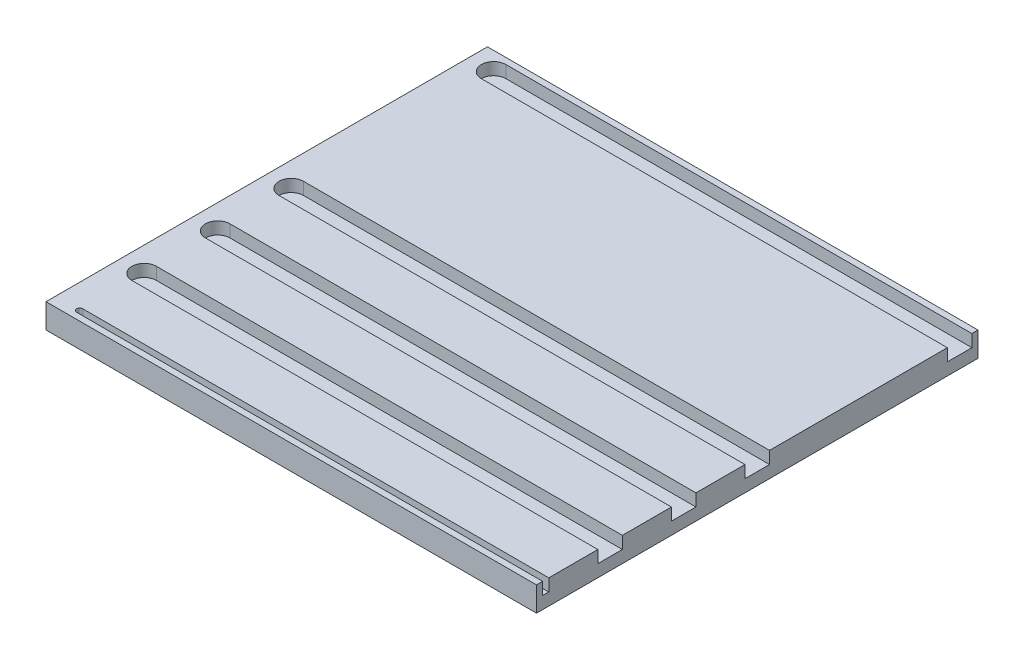
ISO-10303-21;
HEADER;
FILE_DESCRIPTION(('STEP AP214'),'2;1');
FILE_NAME('part.step','',(''),(''),'','','');
FILE_SCHEMA(('AUTOMOTIVE_DESIGN { 1 0 10303 214 1 1 1 1 }'));
ENDSEC;
DATA;
#1=APPLICATION_CONTEXT('core data for automotive mechanical design processes');
#2=APPLICATION_PROTOCOL_DEFINITION('international standard','automotive_design',2000,#1);
#3=PRODUCT_CONTEXT('',#1,'mechanical');
#4=PRODUCT('Part','Part','',(#3));
#5=PRODUCT_RELATED_PRODUCT_CATEGORY('part','',(#4));
#6=PRODUCT_DEFINITION_FORMATION('','',#4);
#7=PRODUCT_DEFINITION_CONTEXT('part definition',#1,'design');
#8=PRODUCT_DEFINITION('design','',#6,#7);
#9=PRODUCT_DEFINITION_SHAPE('','',#8);
#10=(LENGTH_UNIT() NAMED_UNIT(*) SI_UNIT(.MILLI.,.METRE.));
#11=(NAMED_UNIT(*) PLANE_ANGLE_UNIT() SI_UNIT($,.RADIAN.));
#12=(NAMED_UNIT(*) SI_UNIT($,.STERADIAN.) SOLID_ANGLE_UNIT());
#13=UNCERTAINTY_MEASURE_WITH_UNIT(LENGTH_MEASURE(1.E-05),#10,'distance_accuracy_value','');
#14=(GEOMETRIC_REPRESENTATION_CONTEXT(3) GLOBAL_UNCERTAINTY_ASSIGNED_CONTEXT((#13)) GLOBAL_UNIT_ASSIGNED_CONTEXT((#10,
#11,#12)) REPRESENTATION_CONTEXT('',''));
#15=CARTESIAN_POINT('',(0.,0.,0.));
#16=DIRECTION('',(0.,0.,1.));
#17=DIRECTION('',(1.,0.,0.));
#18=AXIS2_PLACEMENT_3D('',#15,#16,#17);
#19=CARTESIAN_POINT('',(6.35,6.35,-2.38125));
#20=DIRECTION('',(0.,-1.,0.));
#21=DIRECTION('',(0.,0.,-1.));
#22=AXIS2_PLACEMENT_3D('',#19,#20,#21);
#23=CYLINDRICAL_SURFACE('',#22,0.79375);
#24=CARTESIAN_POINT('',(6.35,3.175,-2.38125));
#25=DIRECTION('',(0.,1.,0.));
#26=DIRECTION('',(0.,0.,1.));
#27=AXIS2_PLACEMENT_3D('',#24,#25,#26);
#28=CIRCLE('',#27,0.79375);
#29=CARTESIAN_POINT('',(6.34999999999999,3.175,-3.17500000000001));
#30=VERTEX_POINT('',#29);
#31=CARTESIAN_POINT('',(6.34999999999999,3.175,-1.5875));
#32=VERTEX_POINT('',#31);
#33=EDGE_CURVE('E197',#30,#32,#28,.T.);
#34=ORIENTED_EDGE('',*,*,#33,.F.);
#35=DIRECTION('',(0.,-1.,0.));
#36=VECTOR('',#35,1.);
#37=CARTESIAN_POINT('',(6.34999999999999,6.35,-3.17500000000001));
#38=LINE('',#37,#36);
#39=CARTESIAN_POINT('',(6.34999999999999,6.35,-3.17500000000001));
#40=VERTEX_POINT('',#39);
#41=EDGE_CURVE('E11',#40,#30,#38,.T.);
#42=ORIENTED_EDGE('',*,*,#41,.F.);
#43=CARTESIAN_POINT('',(6.35,6.35,-2.38125));
#44=DIRECTION('',(0.,1.,0.));
#45=DIRECTION('',(0.,0.,1.));
#46=AXIS2_PLACEMENT_3D('',#43,#44,#45);
#47=CIRCLE('',#46,0.79375);
#48=CARTESIAN_POINT('',(6.34999999999999,6.35,-1.5875));
#49=VERTEX_POINT('',#48);
#50=EDGE_CURVE('E195',#40,#49,#47,.T.);
#51=ORIENTED_EDGE('',*,*,#50,.T.);
#52=DIRECTION('',(0.,-1.,0.));
#53=VECTOR('',#52,1.);
#54=CARTESIAN_POINT('',(6.34999999999999,6.35,-1.5875));
#55=LINE('',#54,#53);
#56=EDGE_CURVE('E264',#49,#32,#55,.T.);
#57=ORIENTED_EDGE('',*,*,#56,.T.);
#58=EDGE_LOOP('',(#34,#42,#51,#57));
#59=FACE_BOUND('',#58,.T.);
#60=ADVANCED_FACE('F33',(#59),#23,.F.);
#61=CARTESIAN_POINT('',(-69.5401100254638,6.35,-3.175));
#62=DIRECTION('',(0.,0.,1.));
#63=DIRECTION('',(1.,0.,0.));
#64=AXIS2_PLACEMENT_3D('',#61,#62,#63);
#65=PLANE('',#64);
#66=DIRECTION('',(-1.,0.,0.));
#67=VECTOR('',#66,1.);
#68=CARTESIAN_POINT('',(-69.5401100254638,3.175,-3.175));
#69=LINE('',#68,#67);
#70=CARTESIAN_POINT('',(127.,3.175,-3.17500000000001));
#71=VERTEX_POINT('',#70);
#72=EDGE_CURVE('E338',#71,#30,#69,.T.);
#73=ORIENTED_EDGE('',*,*,#72,.F.);
#74=DIRECTION('',(0.,-1.,0.));
#75=VECTOR('',#74,1.);
#76=CARTESIAN_POINT('',(127.,6.35,-3.17500000000001));
#77=LINE('',#76,#75);
#78=CARTESIAN_POINT('',(127.,6.35,-3.17500000000001));
#79=VERTEX_POINT('',#78);
#80=EDGE_CURVE('E40',#79,#71,#77,.T.);
#81=ORIENTED_EDGE('',*,*,#80,.F.);
#82=DIRECTION('',(-1.,0.,0.));
#83=VECTOR('',#82,1.);
#84=CARTESIAN_POINT('',(-69.5401100254638,6.35,-3.175));
#85=LINE('',#84,#83);
#86=EDGE_CURVE('E204',#79,#40,#85,.T.);
#87=ORIENTED_EDGE('',*,*,#86,.T.);
#88=ORIENTED_EDGE('',*,*,#41,.T.);
#89=EDGE_LOOP('',(#73,#81,#87,#88));
#90=FACE_BOUND('',#89,.T.);
#91=ADVANCED_FACE('F210',(#90),#65,.T.);
#92=CARTESIAN_POINT('',(-69.5401100254638,6.35,-15.875));
#93=DIRECTION('',(0.,0.,1.));
#94=DIRECTION('',(1.,0.,0.));
#95=AXIS2_PLACEMENT_3D('',#92,#93,#94);
#96=PLANE('',#95);
#97=DIRECTION('',(0.,-1.,0.));
#98=VECTOR('',#97,1.);
#99=CARTESIAN_POINT('',(127.,6.35,-15.875));
#100=LINE('',#99,#98);
#101=CARTESIAN_POINT('',(127.,6.35,-15.875));
#102=VERTEX_POINT('',#101);
#103=CARTESIAN_POINT('',(127.,3.175,-15.875));
#104=VERTEX_POINT('',#103);
#105=EDGE_CURVE('E328',#102,#104,#100,.T.);
#106=ORIENTED_EDGE('',*,*,#105,.T.);
#107=DIRECTION('',(-1.,0.,0.));
#108=VECTOR('',#107,1.);
#109=CARTESIAN_POINT('',(-69.5401100254638,3.175,-15.875));
#110=LINE('',#109,#108);
#111=CARTESIAN_POINT('',(6.34999999999999,3.175,-15.875));
#112=VERTEX_POINT('',#111);
#113=EDGE_CURVE('E347',#104,#112,#110,.T.);
#114=ORIENTED_EDGE('',*,*,#113,.T.);
#115=DIRECTION('',(0.,-1.,0.));
#116=VECTOR('',#115,1.);
#117=CARTESIAN_POINT('',(6.34999999999999,6.35,-15.875));
#118=LINE('',#117,#116);
#119=CARTESIAN_POINT('',(6.34999999999999,6.35,-15.875));
#120=VERTEX_POINT('',#119);
#121=EDGE_CURVE('E325',#120,#112,#118,.T.);
#122=ORIENTED_EDGE('',*,*,#121,.F.);
#123=DIRECTION('',(-1.,0.,0.));
#124=VECTOR('',#123,1.);
#125=CARTESIAN_POINT('',(-69.5401100254638,6.35,-15.875));
#126=LINE('',#125,#124);
#127=EDGE_CURVE('E215',#102,#120,#126,.T.);
#128=ORIENTED_EDGE('',*,*,#127,.F.);
#129=EDGE_LOOP('',(#106,#114,#122,#128));
#130=FACE_BOUND('',#129,.T.);
#131=ADVANCED_FACE('F445',(#130),#96,.F.);
#132=CARTESIAN_POINT('',(6.35,6.35,-19.05));
#133=DIRECTION('',(0.,-1.,0.));
#134=DIRECTION('',(0.,0.,-1.));
#135=AXIS2_PLACEMENT_3D('',#132,#133,#134);
#136=CYLINDRICAL_SURFACE('',#135,3.175);
#137=CARTESIAN_POINT('',(6.35,3.175,-19.05));
#138=DIRECTION('',(0.,1.,0.));
#139=DIRECTION('',(0.,0.,1.));
#140=AXIS2_PLACEMENT_3D('',#137,#138,#139);
#141=CIRCLE('',#140,3.175);
#142=CARTESIAN_POINT('',(6.34999999999999,3.175,-22.225));
#143=VERTEX_POINT('',#142);
#144=EDGE_CURVE('E349',#143,#112,#141,.T.);
#145=ORIENTED_EDGE('',*,*,#144,.F.);
#146=DIRECTION('',(0.,-1.,0.));
#147=VECTOR('',#146,1.);
#148=CARTESIAN_POINT('',(6.34999999999999,6.35,-22.225));
#149=LINE('',#148,#147);
#150=CARTESIAN_POINT('',(6.34999999999999,6.35,-22.225));
#151=VERTEX_POINT('',#150);
#152=EDGE_CURVE('E322',#151,#143,#149,.T.);
#153=ORIENTED_EDGE('',*,*,#152,.F.);
#154=CARTESIAN_POINT('',(6.35,6.35,-19.05));
#155=DIRECTION('',(0.,1.,0.));
#156=DIRECTION('',(0.,0.,1.));
#157=AXIS2_PLACEMENT_3D('',#154,#155,#156);
#158=CIRCLE('',#157,3.175);
#159=EDGE_CURVE('E222',#151,#120,#158,.T.);
#160=ORIENTED_EDGE('',*,*,#159,.T.);
#161=ORIENTED_EDGE('',*,*,#121,.T.);
#162=EDGE_LOOP('',(#145,#153,#160,#161));
#163=FACE_BOUND('',#162,.T.);
#164=ADVANCED_FACE('F449',(#163),#136,.F.);
#165=CARTESIAN_POINT('',(-69.5401100254638,6.35,-22.225));
#166=DIRECTION('',(0.,0.,1.));
#167=DIRECTION('',(1.,0.,0.));
#168=AXIS2_PLACEMENT_3D('',#165,#166,#167);
#169=PLANE('',#168);
#170=DIRECTION('',(-1.,0.,0.));
#171=VECTOR('',#170,1.);
#172=CARTESIAN_POINT('',(-69.5401100254638,3.175,-22.225));
#173=LINE('',#172,#171);
#174=CARTESIAN_POINT('',(127.,3.175,-22.225));
#175=VERTEX_POINT('',#174);
#176=EDGE_CURVE('E352',#175,#143,#173,.T.);
#177=ORIENTED_EDGE('',*,*,#176,.F.);
#178=DIRECTION('',(0.,-1.,0.));
#179=VECTOR('',#178,1.);
#180=CARTESIAN_POINT('',(127.,6.35,-22.225));
#181=LINE('',#180,#179);
#182=CARTESIAN_POINT('',(127.,6.35,-22.225));
#183=VERTEX_POINT('',#182);
#184=EDGE_CURVE('E319',#183,#175,#181,.T.);
#185=ORIENTED_EDGE('',*,*,#184,.F.);
#186=DIRECTION('',(-1.,0.,0.));
#187=VECTOR('',#186,1.);
#188=CARTESIAN_POINT('',(-69.5401100254638,6.35,-22.225));
#189=LINE('',#188,#187);
#190=EDGE_CURVE('E225',#183,#151,#189,.T.);
#191=ORIENTED_EDGE('',*,*,#190,.T.);
#192=ORIENTED_EDGE('',*,*,#152,.T.);
#193=EDGE_LOOP('',(#177,#185,#191,#192));
#194=FACE_BOUND('',#193,.T.);
#195=ADVANCED_FACE('F455',(#194),#169,.T.);
#196=CARTESIAN_POINT('',(-69.5401100254638,6.35,-34.925));
#197=DIRECTION('',(0.,0.,1.));
#198=DIRECTION('',(1.,0.,0.));
#199=AXIS2_PLACEMENT_3D('',#196,#197,#198);
#200=PLANE('',#199);
#201=DIRECTION('',(0.,-1.,0.));
#202=VECTOR('',#201,1.);
#203=CARTESIAN_POINT('',(127.,6.35,-34.925));
#204=LINE('',#203,#202);
#205=CARTESIAN_POINT('',(127.,6.35,-34.925));
#206=VERTEX_POINT('',#205);
#207=CARTESIAN_POINT('',(127.,3.175,-34.925));
#208=VERTEX_POINT('',#207);
#209=EDGE_CURVE('E317',#206,#208,#204,.T.);
#210=ORIENTED_EDGE('',*,*,#209,.T.);
#211=DIRECTION('',(-1.,0.,0.));
#212=VECTOR('',#211,1.);
#213=CARTESIAN_POINT('',(-69.5401100254638,3.175,-34.925));
#214=LINE('',#213,#212);
#215=CARTESIAN_POINT('',(6.34999999999999,3.175,-34.925));
#216=VERTEX_POINT('',#215);
#217=EDGE_CURVE('E358',#208,#216,#214,.T.);
#218=ORIENTED_EDGE('',*,*,#217,.T.);
#219=DIRECTION('',(0.,-1.,0.));
#220=VECTOR('',#219,1.);
#221=CARTESIAN_POINT('',(6.34999999999999,6.35,-34.925));
#222=LINE('',#221,#220);
#223=CARTESIAN_POINT('',(6.34999999999999,6.35,-34.925));
#224=VERTEX_POINT('',#223);
#225=EDGE_CURVE('E314',#224,#216,#222,.T.);
#226=ORIENTED_EDGE('',*,*,#225,.F.);
#227=DIRECTION('',(-1.,0.,0.));
#228=VECTOR('',#227,1.);
#229=CARTESIAN_POINT('',(-69.5401100254638,6.35,-34.925));
#230=LINE('',#229,#228);
#231=EDGE_CURVE('E228',#206,#224,#230,.T.);
#232=ORIENTED_EDGE('',*,*,#231,.F.);
#233=EDGE_LOOP('',(#210,#218,#226,#232));
#234=FACE_BOUND('',#233,.T.);
#235=ADVANCED_FACE('F424',(#234),#200,.F.);
#236=CARTESIAN_POINT('',(6.35,6.35,-38.1));
#237=DIRECTION('',(0.,-1.,0.));
#238=DIRECTION('',(0.,0.,-1.));
#239=AXIS2_PLACEMENT_3D('',#236,#237,#238);
#240=CYLINDRICAL_SURFACE('',#239,3.175);
#241=CARTESIAN_POINT('',(6.35,3.175,-38.1));
#242=DIRECTION('',(0.,1.,0.));
#243=DIRECTION('',(0.,0.,1.));
#244=AXIS2_PLACEMENT_3D('',#241,#242,#243);
#245=CIRCLE('',#244,3.175);
#246=CARTESIAN_POINT('',(6.34999999999999,3.175,-41.275));
#247=VERTEX_POINT('',#246);
#248=EDGE_CURVE('E360',#247,#216,#245,.T.);
#249=ORIENTED_EDGE('',*,*,#248,.F.);
#250=DIRECTION('',(0.,-1.,0.));
#251=VECTOR('',#250,1.);
#252=CARTESIAN_POINT('',(6.34999999999999,6.35,-41.275));
#253=LINE('',#252,#251);
#254=CARTESIAN_POINT('',(6.34999999999999,6.35,-41.275));
#255=VERTEX_POINT('',#254);
#256=EDGE_CURVE('E311',#255,#247,#253,.T.);
#257=ORIENTED_EDGE('',*,*,#256,.F.);
#258=CARTESIAN_POINT('',(6.35,6.35,-38.1));
#259=DIRECTION('',(0.,1.,0.));
#260=DIRECTION('',(0.,0.,1.));
#261=AXIS2_PLACEMENT_3D('',#258,#259,#260);
#262=CIRCLE('',#261,3.175);
#263=EDGE_CURVE('E230',#255,#224,#262,.T.);
#264=ORIENTED_EDGE('',*,*,#263,.T.);
#265=ORIENTED_EDGE('',*,*,#225,.T.);
#266=EDGE_LOOP('',(#249,#257,#264,#265));
#267=FACE_BOUND('',#266,.T.);
#268=ADVANCED_FACE('F426',(#267),#240,.F.);
#269=CARTESIAN_POINT('',(-69.5401100254638,6.35,-41.275));
#270=DIRECTION('',(0.,0.,1.));
#271=DIRECTION('',(1.,0.,0.));
#272=AXIS2_PLACEMENT_3D('',#269,#270,#271);
#273=PLANE('',#272);
#274=DIRECTION('',(-1.,0.,0.));
#275=VECTOR('',#274,1.);
#276=CARTESIAN_POINT('',(-69.5401100254638,3.175,-41.275));
#277=LINE('',#276,#275);
#278=CARTESIAN_POINT('',(127.,3.175,-41.275));
#279=VERTEX_POINT('',#278);
#280=EDGE_CURVE('E363',#279,#247,#277,.T.);
#281=ORIENTED_EDGE('',*,*,#280,.F.);
#282=DIRECTION('',(0.,-1.,0.));
#283=VECTOR('',#282,1.);
#284=CARTESIAN_POINT('',(127.,6.35,-41.275));
#285=LINE('',#284,#283);
#286=CARTESIAN_POINT('',(127.,6.35,-41.275));
#287=VERTEX_POINT('',#286);
#288=EDGE_CURVE('E308',#287,#279,#285,.T.);
#289=ORIENTED_EDGE('',*,*,#288,.F.);
#290=DIRECTION('',(-1.,0.,0.));
#291=VECTOR('',#290,1.);
#292=CARTESIAN_POINT('',(-69.5401100254638,6.35,-41.275));
#293=LINE('',#292,#291);
#294=EDGE_CURVE('E233',#287,#255,#293,.T.);
#295=ORIENTED_EDGE('',*,*,#294,.T.);
#296=ORIENTED_EDGE('',*,*,#256,.T.);
#297=EDGE_LOOP('',(#281,#289,#295,#296));
#298=FACE_BOUND('',#297,.T.);
#299=ADVANCED_FACE('F428',(#298),#273,.T.);
#300=CARTESIAN_POINT('',(-69.5401100254638,6.35,-53.975));
#301=DIRECTION('',(0.,0.,1.));
#302=DIRECTION('',(1.,0.,0.));
#303=AXIS2_PLACEMENT_3D('',#300,#301,#302);
#304=PLANE('',#303);
#305=DIRECTION('',(0.,-1.,0.));
#306=VECTOR('',#305,1.);
#307=CARTESIAN_POINT('',(127.,6.35,-53.975));
#308=LINE('',#307,#306);
#309=CARTESIAN_POINT('',(127.,6.35,-53.975));
#310=VERTEX_POINT('',#309);
#311=CARTESIAN_POINT('',(127.,3.175,-53.975));
#312=VERTEX_POINT('',#311);
#313=EDGE_CURVE('E306',#310,#312,#308,.T.);
#314=ORIENTED_EDGE('',*,*,#313,.T.);
#315=DIRECTION('',(-1.,0.,0.));
#316=VECTOR('',#315,1.);
#317=CARTESIAN_POINT('',(-69.5401100254638,3.175,-53.975));
#318=LINE('',#317,#316);
#319=CARTESIAN_POINT('',(6.34999999999999,3.175,-53.975));
#320=VERTEX_POINT('',#319);
#321=EDGE_CURVE('E369',#312,#320,#318,.T.);
#322=ORIENTED_EDGE('',*,*,#321,.T.);
#323=DIRECTION('',(0.,-1.,0.));
#324=VECTOR('',#323,1.);
#325=CARTESIAN_POINT('',(6.34999999999999,6.35,-53.975));
#326=LINE('',#325,#324);
#327=CARTESIAN_POINT('',(6.34999999999999,6.35,-53.975));
#328=VERTEX_POINT('',#327);
#329=EDGE_CURVE('E303',#328,#320,#326,.T.);
#330=ORIENTED_EDGE('',*,*,#329,.F.);
#331=DIRECTION('',(-1.,0.,0.));
#332=VECTOR('',#331,1.);
#333=CARTESIAN_POINT('',(-69.5401100254638,6.35,-53.975));
#334=LINE('',#333,#332);
#335=EDGE_CURVE('E237',#310,#328,#334,.T.);
#336=ORIENTED_EDGE('',*,*,#335,.F.);
#337=EDGE_LOOP('',(#314,#322,#330,#336));
#338=FACE_BOUND('',#337,.T.);
#339=ADVANCED_FACE('F413',(#338),#304,.F.);
#340=CARTESIAN_POINT('',(6.35,6.35,-57.15));
#341=DIRECTION('',(0.,-1.,0.));
#342=DIRECTION('',(0.,0.,-1.));
#343=AXIS2_PLACEMENT_3D('',#340,#341,#342);
#344=CYLINDRICAL_SURFACE('',#343,3.175);
#345=CARTESIAN_POINT('',(6.35,3.175,-57.15));
#346=DIRECTION('',(0.,1.,0.));
#347=DIRECTION('',(0.,0.,1.));
#348=AXIS2_PLACEMENT_3D('',#345,#346,#347);
#349=CIRCLE('',#348,3.175);
#350=CARTESIAN_POINT('',(6.34999999999999,3.175,-60.325));
#351=VERTEX_POINT('',#350);
#352=EDGE_CURVE('E371',#351,#320,#349,.T.);
#353=ORIENTED_EDGE('',*,*,#352,.F.);
#354=DIRECTION('',(0.,-1.,0.));
#355=VECTOR('',#354,1.);
#356=CARTESIAN_POINT('',(6.34999999999999,6.35,-60.325));
#357=LINE('',#356,#355);
#358=CARTESIAN_POINT('',(6.34999999999999,6.35,-60.325));
#359=VERTEX_POINT('',#358);
#360=EDGE_CURVE('E300',#359,#351,#357,.T.);
#361=ORIENTED_EDGE('',*,*,#360,.F.);
#362=CARTESIAN_POINT('',(6.35,6.35,-57.15));
#363=DIRECTION('',(0.,1.,0.));
#364=DIRECTION('',(0.,0.,1.));
#365=AXIS2_PLACEMENT_3D('',#362,#363,#364);
#366=CIRCLE('',#365,3.175);
#367=EDGE_CURVE('E239',#359,#328,#366,.T.);
#368=ORIENTED_EDGE('',*,*,#367,.T.);
#369=ORIENTED_EDGE('',*,*,#329,.T.);
#370=EDGE_LOOP('',(#353,#361,#368,#369));
#371=FACE_BOUND('',#370,.T.);
#372=ADVANCED_FACE('F468',(#371),#344,.F.);
#373=CARTESIAN_POINT('',(-69.5401100254638,6.35,-60.325));
#374=DIRECTION('',(0.,0.,1.));
#375=DIRECTION('',(1.,0.,0.));
#376=AXIS2_PLACEMENT_3D('',#373,#374,#375);
#377=PLANE('',#376);
#378=DIRECTION('',(-1.,0.,0.));
#379=VECTOR('',#378,1.);
#380=CARTESIAN_POINT('',(-69.5401100254638,3.175,-60.325));
#381=LINE('',#380,#379);
#382=CARTESIAN_POINT('',(127.,3.175,-60.325));
#383=VERTEX_POINT('',#382);
#384=EDGE_CURVE('E374',#383,#351,#381,.T.);
#385=ORIENTED_EDGE('',*,*,#384,.F.);
#386=DIRECTION('',(0.,-1.,0.));
#387=VECTOR('',#386,1.);
#388=CARTESIAN_POINT('',(127.,6.35,-60.325));
#389=LINE('',#388,#387);
#390=CARTESIAN_POINT('',(127.,6.35,-60.325));
#391=VERTEX_POINT('',#390);
#392=EDGE_CURVE('E297',#391,#383,#389,.T.);
#393=ORIENTED_EDGE('',*,*,#392,.F.);
#394=DIRECTION('',(-1.,0.,0.));
#395=VECTOR('',#394,1.);
#396=CARTESIAN_POINT('',(-69.5401100254638,6.35,-60.325));
#397=LINE('',#396,#395);
#398=EDGE_CURVE('E242',#391,#359,#397,.T.);
#399=ORIENTED_EDGE('',*,*,#398,.T.);
#400=ORIENTED_EDGE('',*,*,#360,.T.);
#401=EDGE_LOOP('',(#385,#393,#399,#400));
#402=FACE_BOUND('',#401,.T.);
#403=ADVANCED_FACE('F403',(#402),#377,.T.);
#404=CARTESIAN_POINT('',(-69.5401100254638,6.35,-106.3625));
#405=DIRECTION('',(0.,0.,1.));
#406=DIRECTION('',(1.,0.,0.));
#407=AXIS2_PLACEMENT_3D('',#404,#405,#406);
#408=PLANE('',#407);
#409=DIRECTION('',(0.,-1.,0.));
#410=VECTOR('',#409,1.);
#411=CARTESIAN_POINT('',(127.,6.35,-106.3625));
#412=LINE('',#411,#410);
#413=CARTESIAN_POINT('',(127.,6.35,-106.3625));
#414=VERTEX_POINT('',#413);
#415=CARTESIAN_POINT('',(127.,3.175,-106.3625));
#416=VERTEX_POINT('',#415);
#417=EDGE_CURVE('E295',#414,#416,#412,.T.);
#418=ORIENTED_EDGE('',*,*,#417,.T.);
#419=DIRECTION('',(-1.,0.,0.));
#420=VECTOR('',#419,1.);
#421=CARTESIAN_POINT('',(-69.5401100254638,3.175,-106.3625));
#422=LINE('',#421,#420);
#423=CARTESIAN_POINT('',(6.34999999999999,3.175,-106.3625));
#424=VERTEX_POINT('',#423);
#425=EDGE_CURVE('E47',#416,#424,#422,.T.);
#426=ORIENTED_EDGE('',*,*,#425,.T.);
#427=DIRECTION('',(0.,-1.,0.));
#428=VECTOR('',#427,1.);
#429=CARTESIAN_POINT('',(6.34999999999999,6.35,-106.3625));
#430=LINE('',#429,#428);
#431=CARTESIAN_POINT('',(6.34999999999999,6.35,-106.3625));
#432=VERTEX_POINT('',#431);
#433=EDGE_CURVE('E293',#432,#424,#430,.T.);
#434=ORIENTED_EDGE('',*,*,#433,.F.);
#435=DIRECTION('',(-1.,0.,0.));
#436=VECTOR('',#435,1.);
#437=CARTESIAN_POINT('',(-69.5401100254638,6.35,-106.3625));
#438=LINE('',#437,#436);
#439=EDGE_CURVE('E246',#414,#432,#438,.T.);
#440=ORIENTED_EDGE('',*,*,#439,.F.);
#441=EDGE_LOOP('',(#418,#426,#434,#440));
#442=FACE_BOUND('',#441,.T.);
#443=ADVANCED_FACE('F397',(#442),#408,.F.);
#444=CARTESIAN_POINT('',(6.34999999999999,6.35,-109.5375));
#445=DIRECTION('',(0.,-1.,0.));
#446=DIRECTION('',(0.,0.,-1.));
#447=AXIS2_PLACEMENT_3D('',#444,#445,#446);
#448=CYLINDRICAL_SURFACE('',#447,3.175);
#449=CARTESIAN_POINT('',(6.34999999999999,3.175,-109.5375));
#450=DIRECTION('',(0.,1.,0.));
#451=DIRECTION('',(0.,0.,1.));
#452=AXIS2_PLACEMENT_3D('',#449,#450,#451);
#453=CIRCLE('',#452,3.175);
#454=CARTESIAN_POINT('',(6.34999999999999,3.175,-112.7125));
#455=VERTEX_POINT('',#454);
#456=EDGE_CURVE('E54',#455,#424,#453,.T.);
#457=ORIENTED_EDGE('',*,*,#456,.F.);
#458=DIRECTION('',(0.,-1.,0.));
#459=VECTOR('',#458,1.);
#460=CARTESIAN_POINT('',(6.34999999999999,6.35,-112.7125));
#461=LINE('',#460,#459);
#462=CARTESIAN_POINT('',(6.34999999999999,6.35,-112.7125));
#463=VERTEX_POINT('',#462);
#464=EDGE_CURVE('E291',#463,#455,#461,.T.);
#465=ORIENTED_EDGE('',*,*,#464,.F.);
#466=CARTESIAN_POINT('',(6.34999999999999,6.35,-109.5375));
#467=DIRECTION('',(0.,1.,0.));
#468=DIRECTION('',(0.,0.,1.));
#469=AXIS2_PLACEMENT_3D('',#466,#467,#468);
#470=CIRCLE('',#469,3.175);
#471=EDGE_CURVE('E248',#463,#432,#470,.T.);
#472=ORIENTED_EDGE('',*,*,#471,.T.);
#473=ORIENTED_EDGE('',*,*,#433,.T.);
#474=EDGE_LOOP('',(#457,#465,#472,#473));
#475=FACE_BOUND('',#474,.T.);
#476=ADVANCED_FACE('F396',(#475),#448,.F.);
#477=CARTESIAN_POINT('',(-69.5401100254638,6.35,-112.7125));
#478=DIRECTION('',(0.,0.,1.));
#479=DIRECTION('',(1.,0.,0.));
#480=AXIS2_PLACEMENT_3D('',#477,#478,#479);
#481=PLANE('',#480);
#482=DIRECTION('',(-1.,0.,0.));
#483=VECTOR('',#482,1.);
#484=CARTESIAN_POINT('',(-69.5401100254638,3.175,-112.7125));
#485=LINE('',#484,#483);
#486=CARTESIAN_POINT('',(127.,3.175,-112.7125));
#487=VERTEX_POINT('',#486);
#488=EDGE_CURVE('E382',#487,#455,#485,.T.);
#489=ORIENTED_EDGE('',*,*,#488,.F.);
#490=DIRECTION('',(0.,-1.,0.));
#491=VECTOR('',#490,1.);
#492=CARTESIAN_POINT('',(127.,6.35,-112.7125));
#493=LINE('',#492,#491);
#494=CARTESIAN_POINT('',(127.,6.35,-112.7125));
#495=VERTEX_POINT('',#494);
#496=EDGE_CURVE('E288',#495,#487,#493,.T.);
#497=ORIENTED_EDGE('',*,*,#496,.F.);
#498=DIRECTION('',(-1.,0.,0.));
#499=VECTOR('',#498,1.);
#500=CARTESIAN_POINT('',(-69.5401100254638,6.35,-112.7125));
#501=LINE('',#500,#499);
#502=EDGE_CURVE('E251',#495,#463,#501,.T.);
#503=ORIENTED_EDGE('',*,*,#502,.T.);
#504=ORIENTED_EDGE('',*,*,#464,.T.);
#505=EDGE_LOOP('',(#489,#497,#503,#504));
#506=FACE_BOUND('',#505,.T.);
#507=ADVANCED_FACE('F388',(#506),#481,.T.);
#508=CARTESIAN_POINT('',(-69.5401100254638,6.35,-114.3));
#509=DIRECTION('',(0.,0.,-1.));
#510=DIRECTION('',(-1.,0.,0.));
#511=AXIS2_PLACEMENT_3D('',#508,#509,#510);
#512=PLANE('',#511);
#513=DIRECTION('',(1.,0.,0.));
#514=VECTOR('',#513,1.);
#515=CARTESIAN_POINT('',(-69.5401100254638,0.,-114.3));
#516=LINE('',#515,#514);
#517=CARTESIAN_POINT('',(0.,0.,-114.3));
#518=VERTEX_POINT('',#517);
#519=CARTESIAN_POINT('',(127.,0.,-114.3));
#520=VERTEX_POINT('',#519);
#521=EDGE_CURVE('E267',#518,#520,#516,.T.);
#522=ORIENTED_EDGE('',*,*,#521,.F.);
#523=DIRECTION('',(0.,-1.,0.));
#524=VECTOR('',#523,1.);
#525=CARTESIAN_POINT('',(0.,6.35,-114.3));
#526=LINE('',#525,#524);
#527=CARTESIAN_POINT('',(0.,6.35,-114.3));
#528=VERTEX_POINT('',#527);
#529=EDGE_CURVE('E283',#528,#518,#526,.T.);
#530=ORIENTED_EDGE('',*,*,#529,.F.);
#531=DIRECTION('',(1.,0.,0.));
#532=VECTOR('',#531,1.);
#533=CARTESIAN_POINT('',(-69.5401100254638,6.35,-114.3));
#534=LINE('',#533,#532);
#535=CARTESIAN_POINT('',(127.,6.35,-114.3));
#536=VERTEX_POINT('',#535);
#537=EDGE_CURVE('E255',#528,#536,#534,.T.);
#538=ORIENTED_EDGE('',*,*,#537,.T.);
#539=DIRECTION('',(0.,-1.,0.));
#540=VECTOR('',#539,1.);
#541=CARTESIAN_POINT('',(127.,6.35,-114.3));
#542=LINE('',#541,#540);
#543=EDGE_CURVE('E285',#536,#520,#542,.T.);
#544=ORIENTED_EDGE('',*,*,#543,.T.);
#545=EDGE_LOOP('',(#522,#530,#538,#544));
#546=FACE_BOUND('',#545,.T.);
#547=ADVANCED_FACE('F480',(#546),#512,.T.);
#548=CARTESIAN_POINT('',(0.,6.35,-57.15));
#549=DIRECTION('',(-1.,0.,0.));
#550=DIRECTION('',(0.,0.,1.));
#551=AXIS2_PLACEMENT_3D('',#548,#549,#550);
#552=PLANE('',#551);
#553=DIRECTION('',(0.,0.,-1.));
#554=VECTOR('',#553,1.);
#555=CARTESIAN_POINT('',(0.,0.,-57.15));
#556=LINE('',#555,#554);
#557=CARTESIAN_POINT('',(0.,0.,0.));
#558=VERTEX_POINT('',#557);
#559=EDGE_CURVE('E270',#558,#518,#556,.T.);
#560=ORIENTED_EDGE('',*,*,#559,.F.);
#561=DIRECTION('',(0.,-1.,0.));
#562=VECTOR('',#561,1.);
#563=CARTESIAN_POINT('',(0.,6.35,0.));
#564=LINE('',#563,#562);
#565=CARTESIAN_POINT('',(0.,6.35,0.));
#566=VERTEX_POINT('',#565);
#567=EDGE_CURVE('E281',#566,#558,#564,.T.);
#568=ORIENTED_EDGE('',*,*,#567,.F.);
#569=DIRECTION('',(0.,0.,-1.));
#570=VECTOR('',#569,1.);
#571=CARTESIAN_POINT('',(0.,6.35,-57.15));
#572=LINE('',#571,#570);
#573=EDGE_CURVE('E258',#566,#528,#572,.T.);
#574=ORIENTED_EDGE('',*,*,#573,.T.);
#575=ORIENTED_EDGE('',*,*,#529,.T.);
#576=EDGE_LOOP('',(#560,#568,#574,#575));
#577=FACE_BOUND('',#576,.T.);
#578=ADVANCED_FACE('F483',(#577),#552,.T.);
#579=CARTESIAN_POINT('',(-69.5401100254638,6.35,0.));
#580=DIRECTION('',(0.,0.,-1.));
#581=DIRECTION('',(-1.,0.,0.));
#582=AXIS2_PLACEMENT_3D('',#579,#580,#581);
#583=PLANE('',#582);
#584=DIRECTION('',(1.,0.,0.));
#585=VECTOR('',#584,1.);
#586=CARTESIAN_POINT('',(-69.5401100254638,0.,0.));
#587=LINE('',#586,#585);
#588=CARTESIAN_POINT('',(127.,0.,0.));
#589=VERTEX_POINT('',#588);
#590=EDGE_CURVE('E266',#558,#589,#587,.T.);
#591=ORIENTED_EDGE('',*,*,#590,.T.);
#592=DIRECTION('',(0.,-1.,0.));
#593=VECTOR('',#592,1.);
#594=CARTESIAN_POINT('',(127.,6.35,0.));
#595=LINE('',#594,#593);
#596=CARTESIAN_POINT('',(127.,6.35,0.));
#597=VERTEX_POINT('',#596);
#598=EDGE_CURVE('E278',#597,#589,#595,.T.);
#599=ORIENTED_EDGE('',*,*,#598,.F.);
#600=DIRECTION('',(1.,0.,0.));
#601=VECTOR('',#600,1.);
#602=CARTESIAN_POINT('',(-69.5401100254638,6.35,0.));
#603=LINE('',#602,#601);
#604=EDGE_CURVE('E261',#566,#597,#603,.T.);
#605=ORIENTED_EDGE('',*,*,#604,.F.);
#606=ORIENTED_EDGE('',*,*,#567,.T.);
#607=EDGE_LOOP('',(#591,#599,#605,#606));
#608=FACE_BOUND('',#607,.T.);
#609=ADVANCED_FACE('F487',(#608),#583,.F.);
#610=CARTESIAN_POINT('',(127.,6.35,-57.15));
#611=DIRECTION('',(-1.,0.,0.));
#612=DIRECTION('',(0.,0.,1.));
#613=AXIS2_PLACEMENT_3D('',#610,#611,#612);
#614=PLANE('',#613);
#615=DIRECTION('',(0.,0.,-1.));
#616=VECTOR('',#615,1.);
#617=CARTESIAN_POINT('',(127.,0.,-57.15));
#618=LINE('',#617,#616);
#619=EDGE_CURVE('E208',#589,#520,#618,.T.);
#620=ORIENTED_EDGE('',*,*,#619,.T.);
#621=ORIENTED_EDGE('',*,*,#543,.F.);
#622=DIRECTION('',(0.,0.,-1.));
#623=VECTOR('',#622,1.);
#624=CARTESIAN_POINT('',(127.,6.35,-57.15));
#625=LINE('',#624,#623);
#626=EDGE_CURVE('E254',#495,#536,#625,.T.);
#627=ORIENTED_EDGE('',*,*,#626,.F.);
#628=ORIENTED_EDGE('',*,*,#496,.T.);
#629=DIRECTION('',(0.,0.,-1.));
#630=VECTOR('',#629,1.);
#631=CARTESIAN_POINT('',(127.,3.175,-57.15));
#632=LINE('',#631,#630);
#633=EDGE_CURVE('E377',#416,#487,#632,.T.);
#634=ORIENTED_EDGE('',*,*,#633,.F.);
#635=ORIENTED_EDGE('',*,*,#417,.F.);
#636=EDGE_CURVE('E245',#391,#414,#625,.T.);
#637=ORIENTED_EDGE('',*,*,#636,.F.);
#638=ORIENTED_EDGE('',*,*,#392,.T.);
#639=DIRECTION('',(0.,0.,-1.));
#640=VECTOR('',#639,1.);
#641=CARTESIAN_POINT('',(127.,3.175,-57.15));
#642=LINE('',#641,#640);
#643=EDGE_CURVE('E366',#312,#383,#642,.T.);
#644=ORIENTED_EDGE('',*,*,#643,.F.);
#645=ORIENTED_EDGE('',*,*,#313,.F.);
#646=EDGE_CURVE('E236',#287,#310,#625,.T.);
#647=ORIENTED_EDGE('',*,*,#646,.F.);
#648=ORIENTED_EDGE('',*,*,#288,.T.);
#649=DIRECTION('',(0.,0.,-1.));
#650=VECTOR('',#649,1.);
#651=CARTESIAN_POINT('',(127.,3.175,-57.15));
#652=LINE('',#651,#650);
#653=EDGE_CURVE('E355',#208,#279,#652,.T.);
#654=ORIENTED_EDGE('',*,*,#653,.F.);
#655=ORIENTED_EDGE('',*,*,#209,.F.);
#656=EDGE_CURVE('E218',#183,#206,#625,.T.);
#657=ORIENTED_EDGE('',*,*,#656,.F.);
#658=ORIENTED_EDGE('',*,*,#184,.T.);
#659=DIRECTION('',(0.,0.,-1.));
#660=VECTOR('',#659,1.);
#661=CARTESIAN_POINT('',(127.,3.175,-57.15));
#662=LINE('',#661,#660);
#663=EDGE_CURVE('E344',#104,#175,#662,.T.);
#664=ORIENTED_EDGE('',*,*,#663,.F.);
#665=ORIENTED_EDGE('',*,*,#105,.F.);
#666=EDGE_CURVE('E213',#79,#102,#625,.T.);
#667=ORIENTED_EDGE('',*,*,#666,.F.);
#668=ORIENTED_EDGE('',*,*,#80,.T.);
#669=DIRECTION('',(0.,0.,-1.));
#670=VECTOR('',#669,1.);
#671=CARTESIAN_POINT('',(127.,3.175,-57.15));
#672=LINE('',#671,#670);
#673=CARTESIAN_POINT('',(127.,3.175,-1.58750000000001));
#674=VERTEX_POINT('',#673);
#675=EDGE_CURVE('E271',#674,#71,#672,.T.);
#676=ORIENTED_EDGE('',*,*,#675,.F.);
#677=DIRECTION('',(0.,-1.,0.));
#678=VECTOR('',#677,1.);
#679=CARTESIAN_POINT('',(127.,6.35,-1.58750000000001));
#680=LINE('',#679,#678);
#681=CARTESIAN_POINT('',(127.,6.35,-1.58750000000001));
#682=VERTEX_POINT('',#681);
#683=EDGE_CURVE('E276',#682,#674,#680,.T.);
#684=ORIENTED_EDGE('',*,*,#683,.F.);
#685=EDGE_CURVE('E217',#597,#682,#625,.T.);
#686=ORIENTED_EDGE('',*,*,#685,.F.);
#687=ORIENTED_EDGE('',*,*,#598,.T.);
#688=EDGE_LOOP('',(#620,#621,#627,#628,#634,#635,#637,#638,#644,#645,#647,#648,#654,#655,#657,
#658,#664,#665,#667,#668,#676,#684,#686,#687));
#689=FACE_BOUND('',#688,.T.);
#690=ADVANCED_FACE('F332',(#689),#614,.F.);
#691=CARTESIAN_POINT('',(-69.5401100254638,6.35,-1.58749999999999));
#692=DIRECTION('',(0.,0.,1.));
#693=DIRECTION('',(1.,0.,0.));
#694=AXIS2_PLACEMENT_3D('',#691,#692,#693);
#695=PLANE('',#694);
#696=ORIENTED_EDGE('',*,*,#683,.T.);
#697=DIRECTION('',(-1.,0.,0.));
#698=VECTOR('',#697,1.);
#699=CARTESIAN_POINT('',(-69.5401100254638,3.175,-1.58749999999999));
#700=LINE('',#699,#698);
#701=EDGE_CURVE('E339',#674,#32,#700,.T.);
#702=ORIENTED_EDGE('',*,*,#701,.T.);
#703=ORIENTED_EDGE('',*,*,#56,.F.);
#704=DIRECTION('',(-1.,0.,0.));
#705=VECTOR('',#704,1.);
#706=CARTESIAN_POINT('',(-69.5401100254638,6.35,-1.58749999999999));
#707=LINE('',#706,#705);
#708=EDGE_CURVE('E206',#682,#49,#707,.T.);
#709=ORIENTED_EDGE('',*,*,#708,.F.);
#710=EDGE_LOOP('',(#696,#702,#703,#709));
#711=FACE_BOUND('',#710,.T.);
#712=ADVANCED_FACE('F494',(#711),#695,.F.);
#713=CARTESIAN_POINT('',(-69.5401100254638,6.35,-57.15));
#714=DIRECTION('',(0.,1.,0.));
#715=DIRECTION('',(0.,0.,1.));
#716=AXIS2_PLACEMENT_3D('',#713,#714,#715);
#717=PLANE('',#716);
#718=ORIENTED_EDGE('',*,*,#50,.F.);
#719=ORIENTED_EDGE('',*,*,#86,.F.);
#720=ORIENTED_EDGE('',*,*,#666,.T.);
#721=ORIENTED_EDGE('',*,*,#127,.T.);
#722=ORIENTED_EDGE('',*,*,#159,.F.);
#723=ORIENTED_EDGE('',*,*,#190,.F.);
#724=ORIENTED_EDGE('',*,*,#656,.T.);
#725=ORIENTED_EDGE('',*,*,#231,.T.);
#726=ORIENTED_EDGE('',*,*,#263,.F.);
#727=ORIENTED_EDGE('',*,*,#294,.F.);
#728=ORIENTED_EDGE('',*,*,#646,.T.);
#729=ORIENTED_EDGE('',*,*,#335,.T.);
#730=ORIENTED_EDGE('',*,*,#367,.F.);
#731=ORIENTED_EDGE('',*,*,#398,.F.);
#732=ORIENTED_EDGE('',*,*,#636,.T.);
#733=ORIENTED_EDGE('',*,*,#439,.T.);
#734=ORIENTED_EDGE('',*,*,#471,.F.);
#735=ORIENTED_EDGE('',*,*,#502,.F.);
#736=ORIENTED_EDGE('',*,*,#626,.T.);
#737=ORIENTED_EDGE('',*,*,#537,.F.);
#738=ORIENTED_EDGE('',*,*,#573,.F.);
#739=ORIENTED_EDGE('',*,*,#604,.T.);
#740=ORIENTED_EDGE('',*,*,#685,.T.);
#741=ORIENTED_EDGE('',*,*,#708,.T.);
#742=EDGE_LOOP('',(#718,#719,#720,#721,#722,#723,#724,#725,#726,#727,#728,#729,#730,#731,#732,
#733,#734,#735,#736,#737,#738,#739,#740,#741));
#743=FACE_BOUND('',#742,.T.);
#744=ADVANCED_FACE('F203',(#743),#717,.T.);
#745=CARTESIAN_POINT('',(-69.5401100254638,0.,-57.15));
#746=DIRECTION('',(0.,1.,0.));
#747=DIRECTION('',(0.,0.,1.));
#748=AXIS2_PLACEMENT_3D('',#745,#746,#747);
#749=PLANE('',#748);
#750=ORIENTED_EDGE('',*,*,#521,.T.);
#751=ORIENTED_EDGE('',*,*,#619,.F.);
#752=ORIENTED_EDGE('',*,*,#590,.F.);
#753=ORIENTED_EDGE('',*,*,#559,.T.);
#754=EDGE_LOOP('',(#750,#751,#752,#753));
#755=FACE_BOUND('',#754,.T.);
#756=ADVANCED_FACE('F498',(#755),#749,.F.);
#757=CARTESIAN_POINT('',(-69.5401100254638,3.175,-57.15));
#758=DIRECTION('',(0.,1.,0.));
#759=DIRECTION('',(0.,0.,1.));
#760=AXIS2_PLACEMENT_3D('',#757,#758,#759);
#761=PLANE('',#760);
#762=ORIENTED_EDGE('',*,*,#72,.T.);
#763=ORIENTED_EDGE('',*,*,#33,.T.);
#764=ORIENTED_EDGE('',*,*,#701,.F.);
#765=ORIENTED_EDGE('',*,*,#675,.T.);
#766=EDGE_LOOP('',(#762,#763,#764,#765));
#767=FACE_BOUND('',#766,.T.);
#768=ADVANCED_FACE('F337',(#767),#761,.T.);
#769=CARTESIAN_POINT('',(-69.5401100254638,3.175,-57.15));
#770=DIRECTION('',(0.,1.,0.));
#771=DIRECTION('',(0.,0.,1.));
#772=AXIS2_PLACEMENT_3D('',#769,#770,#771);
#773=PLANE('',#772);
#774=ORIENTED_EDGE('',*,*,#176,.T.);
#775=ORIENTED_EDGE('',*,*,#144,.T.);
#776=ORIENTED_EDGE('',*,*,#113,.F.);
#777=ORIENTED_EDGE('',*,*,#663,.T.);
#778=EDGE_LOOP('',(#774,#775,#776,#777));
#779=FACE_BOUND('',#778,.T.);
#780=ADVANCED_FACE('F432',(#779),#773,.T.);
#781=CARTESIAN_POINT('',(-69.5401100254638,3.175,-57.15));
#782=DIRECTION('',(0.,1.,0.));
#783=DIRECTION('',(0.,0.,1.));
#784=AXIS2_PLACEMENT_3D('',#781,#782,#783);
#785=PLANE('',#784);
#786=ORIENTED_EDGE('',*,*,#280,.T.);
#787=ORIENTED_EDGE('',*,*,#248,.T.);
#788=ORIENTED_EDGE('',*,*,#217,.F.);
#789=ORIENTED_EDGE('',*,*,#653,.T.);
#790=EDGE_LOOP('',(#786,#787,#788,#789));
#791=FACE_BOUND('',#790,.T.);
#792=ADVANCED_FACE('F430',(#791),#785,.T.);
#793=CARTESIAN_POINT('',(-69.5401100254638,3.175,-57.15));
#794=DIRECTION('',(0.,1.,0.));
#795=DIRECTION('',(0.,0.,1.));
#796=AXIS2_PLACEMENT_3D('',#793,#794,#795);
#797=PLANE('',#796);
#798=ORIENTED_EDGE('',*,*,#384,.T.);
#799=ORIENTED_EDGE('',*,*,#352,.T.);
#800=ORIENTED_EDGE('',*,*,#321,.F.);
#801=ORIENTED_EDGE('',*,*,#643,.T.);
#802=EDGE_LOOP('',(#798,#799,#800,#801));
#803=FACE_BOUND('',#802,.T.);
#804=ADVANCED_FACE('F405',(#803),#797,.T.);
#805=CARTESIAN_POINT('',(-69.5401100254638,3.175,-57.15));
#806=DIRECTION('',(0.,1.,0.));
#807=DIRECTION('',(0.,0.,1.));
#808=AXIS2_PLACEMENT_3D('',#805,#806,#807);
#809=PLANE('',#808);
#810=ORIENTED_EDGE('',*,*,#488,.T.);
#811=ORIENTED_EDGE('',*,*,#456,.T.);
#812=ORIENTED_EDGE('',*,*,#425,.F.);
#813=ORIENTED_EDGE('',*,*,#633,.T.);
#814=EDGE_LOOP('',(#810,#811,#812,#813));
#815=FACE_BOUND('',#814,.T.);
#816=ADVANCED_FACE('F385',(#815),#809,.T.);
#817=CLOSED_SHELL('',(#60,#91,#131,#164,#195,#235,#268,#299,#339,#372,#403,#443,#476,#507,#547,
#578,#609,#690,#712,#744,#756,#768,#780,#792,#804,#816));
#818=MANIFOLD_SOLID_BREP('B2',#817);
#819=ADVANCED_BREP_SHAPE_REPRESENTATION('',(#18,#818),#14);
#820=SHAPE_DEFINITION_REPRESENTATION(#9,#819);
ENDSEC;
END-ISO-10303-21;
